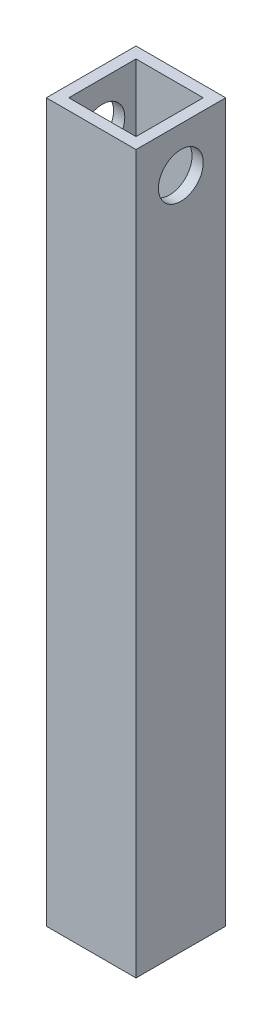
ISO-10303-21;
HEADER;
FILE_DESCRIPTION(('STEP AP214'),'2;1');
FILE_NAME('part.step','',(''),(''),'','','');
FILE_SCHEMA(('AUTOMOTIVE_DESIGN { 1 0 10303 214 1 1 1 1 }'));
ENDSEC;
DATA;
#1=APPLICATION_CONTEXT('core data for automotive mechanical design processes');
#2=APPLICATION_PROTOCOL_DEFINITION('international standard','automotive_design',2000,#1);
#3=PRODUCT_CONTEXT('',#1,'mechanical');
#4=PRODUCT('Part','Part','',(#3));
#5=PRODUCT_RELATED_PRODUCT_CATEGORY('part','',(#4));
#6=PRODUCT_DEFINITION_FORMATION('','',#4);
#7=PRODUCT_DEFINITION_CONTEXT('part definition',#1,'design');
#8=PRODUCT_DEFINITION('design','',#6,#7);
#9=PRODUCT_DEFINITION_SHAPE('','',#8);
#10=(LENGTH_UNIT() NAMED_UNIT(*) SI_UNIT(.MILLI.,.METRE.));
#11=(NAMED_UNIT(*) PLANE_ANGLE_UNIT() SI_UNIT($,.RADIAN.));
#12=(NAMED_UNIT(*) SI_UNIT($,.STERADIAN.) SOLID_ANGLE_UNIT());
#13=UNCERTAINTY_MEASURE_WITH_UNIT(LENGTH_MEASURE(1.E-05),#10,'distance_accuracy_value','');
#14=(GEOMETRIC_REPRESENTATION_CONTEXT(3) GLOBAL_UNCERTAINTY_ASSIGNED_CONTEXT((#13)) GLOBAL_UNIT_ASSIGNED_CONTEXT((#10,
#11,#12)) REPRESENTATION_CONTEXT('',''));
#15=CARTESIAN_POINT('',(0.,0.,0.));
#16=DIRECTION('',(0.,0.,1.));
#17=DIRECTION('',(1.,0.,0.));
#18=AXIS2_PLACEMENT_3D('',#15,#16,#17);
#19=CARTESIAN_POINT('',(0.,203.2,0.));
#20=DIRECTION('',(0.,1.,0.));
#21=DIRECTION('',(0.,0.,1.));
#22=AXIS2_PLACEMENT_3D('',#19,#20,#21);
#23=PLANE('',#22);
#24=DIRECTION('',(0.,0.,-1.));
#25=VECTOR('',#24,1.);
#26=CARTESIAN_POINT('',(12.7,203.2,12.7));
#27=LINE('',#26,#25);
#28=CARTESIAN_POINT('',(12.7,203.2,12.7));
#29=VERTEX_POINT('',#28);
#30=CARTESIAN_POINT('',(12.7,203.2,-12.7));
#31=VERTEX_POINT('',#30);
#32=EDGE_CURVE('E180',#29,#31,#27,.T.);
#33=ORIENTED_EDGE('',*,*,#32,.T.);
#34=DIRECTION('',(-1.,0.,0.));
#35=VECTOR('',#34,1.);
#36=CARTESIAN_POINT('',(-12.7,203.2,-12.7));
#37=LINE('',#36,#35);
#38=CARTESIAN_POINT('',(-12.7,203.2,-12.7));
#39=VERTEX_POINT('',#38);
#40=EDGE_CURVE('E184',#31,#39,#37,.T.);
#41=ORIENTED_EDGE('',*,*,#40,.T.);
#42=DIRECTION('',(0.,0.,1.));
#43=VECTOR('',#42,1.);
#44=CARTESIAN_POINT('',(-12.7,203.2,12.7));
#45=LINE('',#44,#43);
#46=CARTESIAN_POINT('',(-12.7,203.2,12.7));
#47=VERTEX_POINT('',#46);
#48=EDGE_CURVE('E188',#39,#47,#45,.T.);
#49=ORIENTED_EDGE('',*,*,#48,.T.);
#50=DIRECTION('',(1.,0.,0.));
#51=VECTOR('',#50,1.);
#52=CARTESIAN_POINT('',(-12.7,203.2,12.7));
#53=LINE('',#52,#51);
#54=EDGE_CURVE('E191',#47,#29,#53,.T.);
#55=ORIENTED_EDGE('',*,*,#54,.T.);
#56=EDGE_LOOP('',(#33,#41,#49,#55));
#57=FACE_BOUND('',#56,.T.);
#58=DIRECTION('',(-1.,0.,0.));
#59=VECTOR('',#58,1.);
#60=CARTESIAN_POINT('',(0.,203.2,-9.525));
#61=LINE('',#60,#59);
#62=CARTESIAN_POINT('',(9.525,203.2,-9.525));
#63=VERTEX_POINT('',#62);
#64=CARTESIAN_POINT('',(-9.525,203.2,-9.525));
#65=VERTEX_POINT('',#64);
#66=EDGE_CURVE('E139',#63,#65,#61,.T.);
#67=ORIENTED_EDGE('',*,*,#66,.F.);
#68=DIRECTION('',(0.,0.,-1.));
#69=VECTOR('',#68,1.);
#70=CARTESIAN_POINT('',(9.525,203.2,0.));
#71=LINE('',#70,#69);
#72=CARTESIAN_POINT('',(9.525,203.2,9.525));
#73=VERTEX_POINT('',#72);
#74=EDGE_CURVE('E130',#73,#63,#71,.T.);
#75=ORIENTED_EDGE('',*,*,#74,.F.);
#76=DIRECTION('',(1.,0.,0.));
#77=VECTOR('',#76,1.);
#78=CARTESIAN_POINT('',(0.,203.2,9.525));
#79=LINE('',#78,#77);
#80=CARTESIAN_POINT('',(-9.525,203.2,9.525));
#81=VERTEX_POINT('',#80);
#82=EDGE_CURVE('E156',#81,#73,#79,.T.);
#83=ORIENTED_EDGE('',*,*,#82,.F.);
#84=DIRECTION('',(0.,0.,1.));
#85=VECTOR('',#84,1.);
#86=CARTESIAN_POINT('',(-9.525,203.2,0.));
#87=LINE('',#86,#85);
#88=EDGE_CURVE('E152',#65,#81,#87,.T.);
#89=ORIENTED_EDGE('',*,*,#88,.F.);
#90=EDGE_LOOP('',(#67,#75,#83,#89));
#91=FACE_BOUND('',#90,.T.);
#92=ADVANCED_FACE('F63',(#57,#91),#23,.T.);
#93=CARTESIAN_POINT('',(0.,0.,0.));
#94=DIRECTION('',(0.,1.,0.));
#95=DIRECTION('',(0.,0.,1.));
#96=AXIS2_PLACEMENT_3D('',#93,#94,#95);
#97=PLANE('',#96);
#98=DIRECTION('',(0.,0.,-1.));
#99=VECTOR('',#98,1.);
#100=CARTESIAN_POINT('',(12.7,0.,12.7));
#101=LINE('',#100,#99);
#102=CARTESIAN_POINT('',(12.7,0.,12.7));
#103=VERTEX_POINT('',#102);
#104=CARTESIAN_POINT('',(12.7,0.,-12.7));
#105=VERTEX_POINT('',#104);
#106=EDGE_CURVE('E148',#103,#105,#101,.T.);
#107=ORIENTED_EDGE('',*,*,#106,.F.);
#108=DIRECTION('',(1.,0.,0.));
#109=VECTOR('',#108,1.);
#110=CARTESIAN_POINT('',(-12.7,0.,12.7));
#111=LINE('',#110,#109);
#112=CARTESIAN_POINT('',(-12.7,0.,12.7));
#113=VERTEX_POINT('',#112);
#114=EDGE_CURVE('E185',#113,#103,#111,.T.);
#115=ORIENTED_EDGE('',*,*,#114,.F.);
#116=DIRECTION('',(0.,0.,1.));
#117=VECTOR('',#116,1.);
#118=CARTESIAN_POINT('',(-12.7,0.,12.7));
#119=LINE('',#118,#117);
#120=CARTESIAN_POINT('',(-12.7,0.,-12.7));
#121=VERTEX_POINT('',#120);
#122=EDGE_CURVE('E201',#121,#113,#119,.T.);
#123=ORIENTED_EDGE('',*,*,#122,.F.);
#124=DIRECTION('',(-1.,0.,0.));
#125=VECTOR('',#124,1.);
#126=CARTESIAN_POINT('',(-12.7,0.,-12.7));
#127=LINE('',#126,#125);
#128=EDGE_CURVE('E198',#105,#121,#127,.T.);
#129=ORIENTED_EDGE('',*,*,#128,.F.);
#130=EDGE_LOOP('',(#107,#115,#123,#129));
#131=FACE_BOUND('',#130,.T.);
#132=DIRECTION('',(0.,0.,-1.));
#133=VECTOR('',#132,1.);
#134=CARTESIAN_POINT('',(9.525,0.,0.));
#135=LINE('',#134,#133);
#136=CARTESIAN_POINT('',(9.525,0.,9.525));
#137=VERTEX_POINT('',#136);
#138=CARTESIAN_POINT('',(9.525,0.,-9.525));
#139=VERTEX_POINT('',#138);
#140=EDGE_CURVE('E88',#137,#139,#135,.T.);
#141=ORIENTED_EDGE('',*,*,#140,.T.);
#142=DIRECTION('',(-1.,0.,0.));
#143=VECTOR('',#142,1.);
#144=CARTESIAN_POINT('',(0.,0.,-9.525));
#145=LINE('',#144,#143);
#146=CARTESIAN_POINT('',(-9.525,0.,-9.525));
#147=VERTEX_POINT('',#146);
#148=EDGE_CURVE('E146',#139,#147,#145,.T.);
#149=ORIENTED_EDGE('',*,*,#148,.T.);
#150=DIRECTION('',(0.,0.,1.));
#151=VECTOR('',#150,1.);
#152=CARTESIAN_POINT('',(-9.525,0.,0.));
#153=LINE('',#152,#151);
#154=CARTESIAN_POINT('',(-9.525,0.,9.525));
#155=VERTEX_POINT('',#154);
#156=EDGE_CURVE('E167',#147,#155,#153,.T.);
#157=ORIENTED_EDGE('',*,*,#156,.T.);
#158=DIRECTION('',(1.,0.,0.));
#159=VECTOR('',#158,1.);
#160=CARTESIAN_POINT('',(0.,0.,9.525));
#161=LINE('',#160,#159);
#162=EDGE_CURVE('E140',#155,#137,#161,.T.);
#163=ORIENTED_EDGE('',*,*,#162,.T.);
#164=EDGE_LOOP('',(#141,#149,#157,#163));
#165=FACE_BOUND('',#164,.T.);
#166=ADVANCED_FACE('F225',(#131,#165),#97,.F.);
#167=CARTESIAN_POINT('',(12.7,203.2,12.7));
#168=DIRECTION('',(-1.,0.,0.));
#169=DIRECTION('',(0.,0.,1.));
#170=AXIS2_PLACEMENT_3D('',#167,#168,#169);
#171=PLANE('',#170);
#172=CARTESIAN_POINT('',(12.7,190.5,0.));
#173=DIRECTION('',(1.,0.,0.));
#174=DIRECTION('',(0.,0.,-1.));
#175=AXIS2_PLACEMENT_3D('',#172,#173,#174);
#176=CIRCLE('',#175,6.34999999999999);
#177=CARTESIAN_POINT('',(12.7,190.5,-6.34999999999999));
#178=VERTEX_POINT('',#177);
#179=EDGE_CURVE('E270',#178,#178,#176,.T.);
#180=ORIENTED_EDGE('',*,*,#179,.F.);
#181=EDGE_LOOP('',(#180));
#182=FACE_BOUND('',#181,.T.);
#183=ORIENTED_EDGE('',*,*,#106,.T.);
#184=DIRECTION('',(0.,-1.,0.));
#185=VECTOR('',#184,1.);
#186=CARTESIAN_POINT('',(12.7,203.2,-12.7));
#187=LINE('',#186,#185);
#188=EDGE_CURVE('E12',#31,#105,#187,.T.);
#189=ORIENTED_EDGE('',*,*,#188,.F.);
#190=ORIENTED_EDGE('',*,*,#32,.F.);
#191=DIRECTION('',(0.,-1.,0.));
#192=VECTOR('',#191,1.);
#193=CARTESIAN_POINT('',(12.7,203.2,12.7));
#194=LINE('',#193,#192);
#195=EDGE_CURVE('E194',#29,#103,#194,.T.);
#196=ORIENTED_EDGE('',*,*,#195,.T.);
#197=EDGE_LOOP('',(#183,#189,#190,#196));
#198=FACE_BOUND('',#197,.T.);
#199=ADVANCED_FACE('F65',(#182,#198),#171,.F.);
#200=CARTESIAN_POINT('',(-12.7,203.2,-12.7));
#201=DIRECTION('',(0.,0.,1.));
#202=DIRECTION('',(1.,0.,0.));
#203=AXIS2_PLACEMENT_3D('',#200,#201,#202);
#204=PLANE('',#203);
#205=ORIENTED_EDGE('',*,*,#128,.T.);
#206=DIRECTION('',(0.,-1.,0.));
#207=VECTOR('',#206,1.);
#208=CARTESIAN_POINT('',(-12.7,203.2,-12.7));
#209=LINE('',#208,#207);
#210=EDGE_CURVE('E73',#39,#121,#209,.T.);
#211=ORIENTED_EDGE('',*,*,#210,.F.);
#212=ORIENTED_EDGE('',*,*,#40,.F.);
#213=ORIENTED_EDGE('',*,*,#188,.T.);
#214=EDGE_LOOP('',(#205,#211,#212,#213));
#215=FACE_BOUND('',#214,.T.);
#216=ADVANCED_FACE('F235',(#215),#204,.F.);
#217=CARTESIAN_POINT('',(-12.7,203.2,12.7));
#218=DIRECTION('',(1.,0.,0.));
#219=DIRECTION('',(0.,0.,-1.));
#220=AXIS2_PLACEMENT_3D('',#217,#218,#219);
#221=PLANE('',#220);
#222=CARTESIAN_POINT('',(-12.7,190.5,0.));
#223=DIRECTION('',(1.,0.,0.));
#224=DIRECTION('',(0.,0.,-1.));
#225=AXIS2_PLACEMENT_3D('',#222,#223,#224);
#226=CIRCLE('',#225,6.34999999999999);
#227=CARTESIAN_POINT('',(-12.7,190.5,-6.34999999999999));
#228=VERTEX_POINT('',#227);
#229=EDGE_CURVE('E268',#228,#228,#226,.T.);
#230=ORIENTED_EDGE('',*,*,#229,.T.);
#231=EDGE_LOOP('',(#230));
#232=FACE_BOUND('',#231,.T.);
#233=ORIENTED_EDGE('',*,*,#122,.T.);
#234=DIRECTION('',(0.,-1.,0.));
#235=VECTOR('',#234,1.);
#236=CARTESIAN_POINT('',(-12.7,203.2,12.7));
#237=LINE('',#236,#235);
#238=EDGE_CURVE('E209',#47,#113,#237,.T.);
#239=ORIENTED_EDGE('',*,*,#238,.F.);
#240=ORIENTED_EDGE('',*,*,#48,.F.);
#241=ORIENTED_EDGE('',*,*,#210,.T.);
#242=EDGE_LOOP('',(#233,#239,#240,#241));
#243=FACE_BOUND('',#242,.T.);
#244=ADVANCED_FACE('F219',(#232,#243),#221,.F.);
#245=CARTESIAN_POINT('',(-12.7,203.2,12.7));
#246=DIRECTION('',(0.,0.,-1.));
#247=DIRECTION('',(-1.,0.,0.));
#248=AXIS2_PLACEMENT_3D('',#245,#246,#247);
#249=PLANE('',#248);
#250=ORIENTED_EDGE('',*,*,#114,.T.);
#251=ORIENTED_EDGE('',*,*,#195,.F.);
#252=ORIENTED_EDGE('',*,*,#54,.F.);
#253=ORIENTED_EDGE('',*,*,#238,.T.);
#254=EDGE_LOOP('',(#250,#251,#252,#253));
#255=FACE_BOUND('',#254,.T.);
#256=ADVANCED_FACE('F229',(#255),#249,.F.);
#257=CARTESIAN_POINT('',(9.525,203.2,0.));
#258=DIRECTION('',(-1.,0.,0.));
#259=DIRECTION('',(0.,0.,1.));
#260=AXIS2_PLACEMENT_3D('',#257,#258,#259);
#261=PLANE('',#260);
#262=CARTESIAN_POINT('',(9.525,190.5,0.));
#263=DIRECTION('',(-1.,0.,0.));
#264=DIRECTION('',(0.,0.,1.));
#265=AXIS2_PLACEMENT_3D('',#262,#263,#264);
#266=CIRCLE('',#265,6.34999999999999);
#267=CARTESIAN_POINT('',(9.525,190.5,6.34999999999999));
#268=VERTEX_POINT('',#267);
#269=EDGE_CURVE('E164',#268,#268,#266,.T.);
#270=ORIENTED_EDGE('',*,*,#269,.F.);
#271=EDGE_LOOP('',(#270));
#272=FACE_BOUND('',#271,.T.);
#273=ORIENTED_EDGE('',*,*,#140,.F.);
#274=DIRECTION('',(0.,-1.,0.));
#275=VECTOR('',#274,1.);
#276=CARTESIAN_POINT('',(9.525,203.2,9.525));
#277=LINE('',#276,#275);
#278=EDGE_CURVE('E134',#73,#137,#277,.T.);
#279=ORIENTED_EDGE('',*,*,#278,.F.);
#280=ORIENTED_EDGE('',*,*,#74,.T.);
#281=DIRECTION('',(0.,-1.,0.));
#282=VECTOR('',#281,1.);
#283=CARTESIAN_POINT('',(9.525,203.2,-9.525));
#284=LINE('',#283,#282);
#285=EDGE_CURVE('E133',#63,#139,#284,.T.);
#286=ORIENTED_EDGE('',*,*,#285,.T.);
#287=EDGE_LOOP('',(#273,#279,#280,#286));
#288=FACE_BOUND('',#287,.T.);
#289=ADVANCED_FACE('F132',(#272,#288),#261,.T.);
#290=CARTESIAN_POINT('',(0.,203.2,-9.525));
#291=DIRECTION('',(0.,0.,1.));
#292=DIRECTION('',(1.,0.,0.));
#293=AXIS2_PLACEMENT_3D('',#290,#291,#292);
#294=PLANE('',#293);
#295=ORIENTED_EDGE('',*,*,#148,.F.);
#296=ORIENTED_EDGE('',*,*,#285,.F.);
#297=ORIENTED_EDGE('',*,*,#66,.T.);
#298=DIRECTION('',(0.,-1.,0.));
#299=VECTOR('',#298,1.);
#300=CARTESIAN_POINT('',(-9.525,203.2,-9.525));
#301=LINE('',#300,#299);
#302=EDGE_CURVE('E149',#65,#147,#301,.T.);
#303=ORIENTED_EDGE('',*,*,#302,.T.);
#304=EDGE_LOOP('',(#295,#296,#297,#303));
#305=FACE_BOUND('',#304,.T.);
#306=ADVANCED_FACE('F143',(#305),#294,.T.);
#307=CARTESIAN_POINT('',(-9.525,203.2,0.));
#308=DIRECTION('',(1.,0.,0.));
#309=DIRECTION('',(0.,0.,-1.));
#310=AXIS2_PLACEMENT_3D('',#307,#308,#309);
#311=PLANE('',#310);
#312=CARTESIAN_POINT('',(-9.525,190.5,0.));
#313=DIRECTION('',(1.,0.,0.));
#314=DIRECTION('',(0.,0.,-1.));
#315=AXIS2_PLACEMENT_3D('',#312,#313,#314);
#316=CIRCLE('',#315,6.34999999999999);
#317=CARTESIAN_POINT('',(-9.525,190.5,-6.34999999999999));
#318=VERTEX_POINT('',#317);
#319=EDGE_CURVE('E67',#318,#318,#316,.T.);
#320=ORIENTED_EDGE('',*,*,#319,.F.);
#321=EDGE_LOOP('',(#320));
#322=FACE_BOUND('',#321,.T.);
#323=ORIENTED_EDGE('',*,*,#156,.F.);
#324=ORIENTED_EDGE('',*,*,#302,.F.);
#325=ORIENTED_EDGE('',*,*,#88,.T.);
#326=DIRECTION('',(0.,-1.,0.));
#327=VECTOR('',#326,1.);
#328=CARTESIAN_POINT('',(-9.525,203.2,9.525));
#329=LINE('',#328,#327);
#330=EDGE_CURVE('E80',#81,#155,#329,.T.);
#331=ORIENTED_EDGE('',*,*,#330,.T.);
#332=EDGE_LOOP('',(#323,#324,#325,#331));
#333=FACE_BOUND('',#332,.T.);
#334=ADVANCED_FACE('F261',(#322,#333),#311,.T.);
#335=CARTESIAN_POINT('',(0.,203.2,9.525));
#336=DIRECTION('',(0.,0.,-1.));
#337=DIRECTION('',(-1.,0.,0.));
#338=AXIS2_PLACEMENT_3D('',#335,#336,#337);
#339=PLANE('',#338);
#340=ORIENTED_EDGE('',*,*,#162,.F.);
#341=ORIENTED_EDGE('',*,*,#330,.F.);
#342=ORIENTED_EDGE('',*,*,#82,.T.);
#343=ORIENTED_EDGE('',*,*,#278,.T.);
#344=EDGE_LOOP('',(#340,#341,#342,#343));
#345=FACE_BOUND('',#344,.T.);
#346=ADVANCED_FACE('F281',(#345),#339,.T.);
#347=CARTESIAN_POINT('',(-12.7,190.5,0.));
#348=DIRECTION('',(1.,0.,0.));
#349=DIRECTION('',(0.,0.,-1.));
#350=AXIS2_PLACEMENT_3D('',#347,#348,#349);
#351=CYLINDRICAL_SURFACE('',#350,6.34999999999999);
#352=ORIENTED_EDGE('',*,*,#319,.T.);
#353=EDGE_LOOP('',(#352));
#354=FACE_BOUND('',#353,.T.);
#355=ORIENTED_EDGE('',*,*,#229,.F.);
#356=EDGE_LOOP('',(#355));
#357=FACE_BOUND('',#356,.T.);
#358=ADVANCED_FACE('F278',(#354,#357),#351,.F.);
#359=ORIENTED_EDGE('',*,*,#269,.T.);
#360=EDGE_LOOP('',(#359));
#361=FACE_BOUND('',#360,.T.);
#362=ORIENTED_EDGE('',*,*,#179,.T.);
#363=EDGE_LOOP('',(#362));
#364=FACE_BOUND('',#363,.T.);
#365=ADVANCED_FACE('F280',(#361,#364),#351,.F.);
#366=CLOSED_SHELL('',(#92,#166,#199,#216,#244,#256,#289,#306,#334,#346,#358,#365));
#367=MANIFOLD_SOLID_BREP('B2',#366);
#368=ADVANCED_BREP_SHAPE_REPRESENTATION('',(#18,#367),#14);
#369=SHAPE_DEFINITION_REPRESENTATION(#9,#368);
ENDSEC;
END-ISO-10303-21;
